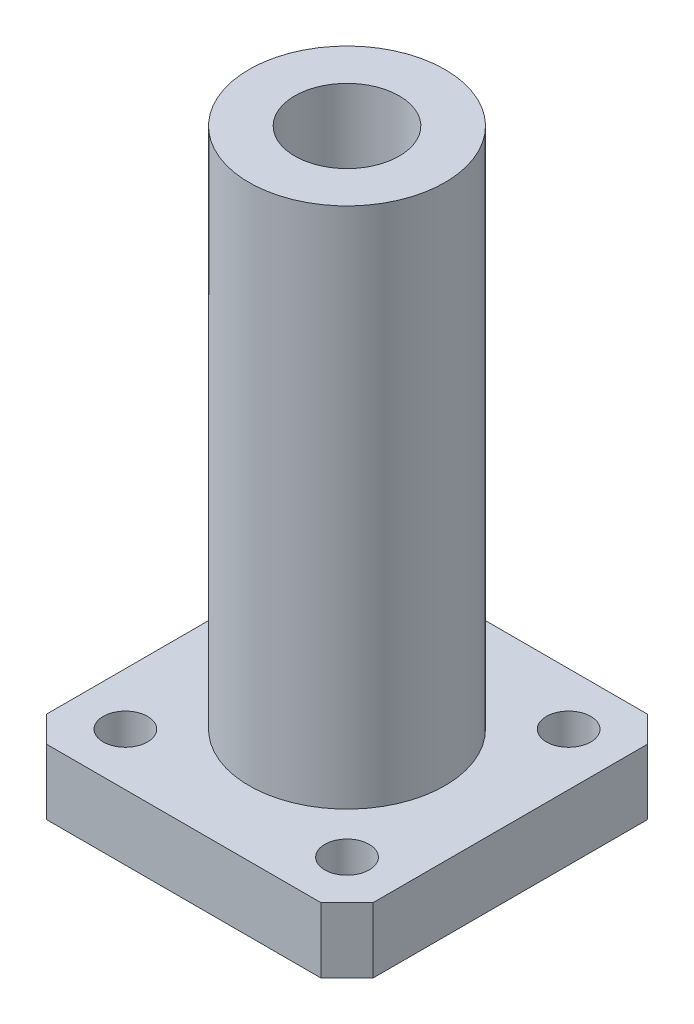
ISO-10303-21;
HEADER;
FILE_DESCRIPTION(('STEP AP214'),'2;1');
FILE_NAME('part.step','',(''),(''),'','','');
FILE_SCHEMA(('AUTOMOTIVE_DESIGN { 1 0 10303 214 1 1 1 1 }'));
ENDSEC;
DATA;
#1=APPLICATION_CONTEXT('core data for automotive mechanical design processes');
#2=APPLICATION_PROTOCOL_DEFINITION('international standard','automotive_design',2000,#1);
#3=PRODUCT_CONTEXT('',#1,'mechanical');
#4=PRODUCT('Part','Part','',(#3));
#5=PRODUCT_RELATED_PRODUCT_CATEGORY('part','',(#4));
#6=PRODUCT_DEFINITION_FORMATION('','',#4);
#7=PRODUCT_DEFINITION_CONTEXT('part definition',#1,'design');
#8=PRODUCT_DEFINITION('design','',#6,#7);
#9=PRODUCT_DEFINITION_SHAPE('','',#8);
#10=(LENGTH_UNIT() NAMED_UNIT(*) SI_UNIT(.MILLI.,.METRE.));
#11=(NAMED_UNIT(*) PLANE_ANGLE_UNIT() SI_UNIT($,.RADIAN.));
#12=(NAMED_UNIT(*) SI_UNIT($,.STERADIAN.) SOLID_ANGLE_UNIT());
#13=UNCERTAINTY_MEASURE_WITH_UNIT(LENGTH_MEASURE(1.E-05),#10,'distance_accuracy_value','');
#14=(GEOMETRIC_REPRESENTATION_CONTEXT(3) GLOBAL_UNCERTAINTY_ASSIGNED_CONTEXT((#13)) GLOBAL_UNIT_ASSIGNED_CONTEXT((#10,
#11,#12)) REPRESENTATION_CONTEXT('',''));
#15=CARTESIAN_POINT('',(0.,0.,0.));
#16=DIRECTION('',(0.,0.,1.));
#17=DIRECTION('',(1.,0.,0.));
#18=AXIS2_PLACEMENT_3D('',#15,#16,#17);
#19=CARTESIAN_POINT('',(8.48528137423857,1.7,-8.48528137423857));
#20=DIRECTION('',(0.,-1.,0.));
#21=DIRECTION('',(0.,0.,-1.));
#22=AXIS2_PLACEMENT_3D('',#19,#20,#21);
#23=CYLINDRICAL_SURFACE('',#22,3.25);
#24=CARTESIAN_POINT('',(8.48528137423857,0.,-8.48528137423857));
#25=DIRECTION('',(0.,-1.,0.));
#26=DIRECTION('',(0.,0.,-1.));
#27=AXIS2_PLACEMENT_3D('',#24,#25,#26);
#28=CIRCLE('',#27,3.25);
#29=CARTESIAN_POINT('',(8.48528137423857,0.,-11.7352813742386));
#30=VERTEX_POINT('',#29);
#31=EDGE_CURVE('E156',#30,#30,#28,.F.);
#32=ORIENTED_EDGE('',*,*,#31,.F.);
#33=EDGE_LOOP('',(#32));
#34=FACE_BOUND('',#33,.T.);
#35=CARTESIAN_POINT('',(8.48528137423857,1.7,-8.48528137423857));
#36=DIRECTION('',(0.,-1.,0.));
#37=DIRECTION('',(0.,0.,-1.));
#38=AXIS2_PLACEMENT_3D('',#35,#36,#37);
#39=CIRCLE('',#38,3.25);
#40=CARTESIAN_POINT('',(8.48528137423857,1.7,-11.7352813742386));
#41=VERTEX_POINT('',#40);
#42=EDGE_CURVE('E158',#41,#41,#39,.T.);
#43=ORIENTED_EDGE('',*,*,#42,.F.);
#44=EDGE_LOOP('',(#43));
#45=FACE_BOUND('',#44,.T.);
#46=ADVANCED_FACE('F16',(#34,#45),#23,.F.);
#47=CARTESIAN_POINT('',(-8.48528137423857,1.7,8.48528137423857));
#48=DIRECTION('',(0.,-1.,0.));
#49=DIRECTION('',(0.,0.,-1.));
#50=AXIS2_PLACEMENT_3D('',#47,#48,#49);
#51=CYLINDRICAL_SURFACE('',#50,3.25);
#52=CARTESIAN_POINT('',(-8.48528137423857,0.,8.48528137423857));
#53=DIRECTION('',(0.,-1.,0.));
#54=DIRECTION('',(0.,0.,-1.));
#55=AXIS2_PLACEMENT_3D('',#52,#53,#54);
#56=CIRCLE('',#55,3.25);
#57=CARTESIAN_POINT('',(-8.48528137423857,0.,5.23528137423857));
#58=VERTEX_POINT('',#57);
#59=EDGE_CURVE('E147',#58,#58,#56,.F.);
#60=ORIENTED_EDGE('',*,*,#59,.F.);
#61=EDGE_LOOP('',(#60));
#62=FACE_BOUND('',#61,.T.);
#63=CARTESIAN_POINT('',(-8.48528137423857,1.7,8.48528137423857));
#64=DIRECTION('',(0.,-1.,0.));
#65=DIRECTION('',(0.,0.,-1.));
#66=AXIS2_PLACEMENT_3D('',#63,#64,#65);
#67=CIRCLE('',#66,3.25);
#68=CARTESIAN_POINT('',(-8.48528137423857,1.7,5.23528137423857));
#69=VERTEX_POINT('',#68);
#70=EDGE_CURVE('E19',#69,#69,#67,.T.);
#71=ORIENTED_EDGE('',*,*,#70,.F.);
#72=EDGE_LOOP('',(#71));
#73=FACE_BOUND('',#72,.T.);
#74=ADVANCED_FACE('F168',(#62,#73),#51,.F.);
#75=CARTESIAN_POINT('',(-8.48528137423857,1.7,-8.48528137423857));
#76=DIRECTION('',(0.,-1.,0.));
#77=DIRECTION('',(0.,0.,-1.));
#78=AXIS2_PLACEMENT_3D('',#75,#76,#77);
#79=CYLINDRICAL_SURFACE('',#78,3.25);
#80=CARTESIAN_POINT('',(-8.48528137423857,0.,-8.48528137423857));
#81=DIRECTION('',(0.,-1.,0.));
#82=DIRECTION('',(0.,0.,-1.));
#83=AXIS2_PLACEMENT_3D('',#80,#81,#82);
#84=CIRCLE('',#83,3.25);
#85=CARTESIAN_POINT('',(-8.48528137423857,0.,-11.7352813742386));
#86=VERTEX_POINT('',#85);
#87=EDGE_CURVE('E153',#86,#86,#84,.F.);
#88=ORIENTED_EDGE('',*,*,#87,.F.);
#89=EDGE_LOOP('',(#88));
#90=FACE_BOUND('',#89,.T.);
#91=CARTESIAN_POINT('',(-8.48528137423857,1.7,-8.48528137423857));
#92=DIRECTION('',(0.,-1.,0.));
#93=DIRECTION('',(0.,0.,-1.));
#94=AXIS2_PLACEMENT_3D('',#91,#92,#93);
#95=CIRCLE('',#94,3.25);
#96=CARTESIAN_POINT('',(-8.48528137423857,1.7,-11.7352813742386));
#97=VERTEX_POINT('',#96);
#98=EDGE_CURVE('E144',#97,#97,#95,.T.);
#99=ORIENTED_EDGE('',*,*,#98,.F.);
#100=EDGE_LOOP('',(#99));
#101=FACE_BOUND('',#100,.T.);
#102=ADVANCED_FACE('F170',(#90,#101),#79,.F.);
#103=CARTESIAN_POINT('',(8.48528137423857,1.7,8.48528137423857));
#104=DIRECTION('',(0.,-1.,0.));
#105=DIRECTION('',(0.,0.,-1.));
#106=AXIS2_PLACEMENT_3D('',#103,#104,#105);
#107=CYLINDRICAL_SURFACE('',#106,3.25);
#108=CARTESIAN_POINT('',(8.48528137423857,0.,8.48528137423857));
#109=DIRECTION('',(0.,-1.,0.));
#110=DIRECTION('',(0.,0.,-1.));
#111=AXIS2_PLACEMENT_3D('',#108,#109,#110);
#112=CIRCLE('',#111,3.25);
#113=CARTESIAN_POINT('',(8.48528137423857,0.,5.23528137423857));
#114=VERTEX_POINT('',#113);
#115=EDGE_CURVE('E150',#114,#114,#112,.F.);
#116=ORIENTED_EDGE('',*,*,#115,.F.);
#117=EDGE_LOOP('',(#116));
#118=FACE_BOUND('',#117,.T.);
#119=CARTESIAN_POINT('',(8.48528137423857,1.7,8.48528137423857));
#120=DIRECTION('',(0.,-1.,0.));
#121=DIRECTION('',(0.,0.,-1.));
#122=AXIS2_PLACEMENT_3D('',#119,#120,#121);
#123=CIRCLE('',#122,3.25);
#124=CARTESIAN_POINT('',(8.48528137423857,1.7,5.23528137423857));
#125=VERTEX_POINT('',#124);
#126=EDGE_CURVE('E141',#125,#125,#123,.T.);
#127=ORIENTED_EDGE('',*,*,#126,.F.);
#128=EDGE_LOOP('',(#127));
#129=FACE_BOUND('',#128,.T.);
#130=ADVANCED_FACE('F177',(#118,#129),#107,.F.);
#131=CARTESIAN_POINT('',(-8.48528137423857,1.7,8.48528137423857));
#132=DIRECTION('',(0.,-1.,0.));
#133=DIRECTION('',(0.,0.,-1.));
#134=AXIS2_PLACEMENT_3D('',#131,#132,#133);
#135=PLANE('',#134);
#136=ORIENTED_EDGE('',*,*,#70,.T.);
#137=EDGE_LOOP('',(#136));
#138=FACE_BOUND('',#137,.T.);
#139=CARTESIAN_POINT('',(-8.48528137423857,1.7,8.48528137423857));
#140=DIRECTION('',(0.,-1.,0.));
#141=DIRECTION('',(0.,0.,-1.));
#142=AXIS2_PLACEMENT_3D('',#139,#140,#141);
#143=CIRCLE('',#142,1.7);
#144=CARTESIAN_POINT('',(-8.48528137423857,1.7,6.78528137423857));
#145=VERTEX_POINT('',#144);
#146=EDGE_CURVE('E135',#145,#145,#143,.F.);
#147=ORIENTED_EDGE('',*,*,#146,.T.);
#148=EDGE_LOOP('',(#147));
#149=FACE_BOUND('',#148,.T.);
#150=ADVANCED_FACE('F165',(#138,#149),#135,.T.);
#151=CARTESIAN_POINT('',(8.48528137423857,1.7,-8.48528137423857));
#152=DIRECTION('',(0.,-1.,0.));
#153=DIRECTION('',(0.,0.,-1.));
#154=AXIS2_PLACEMENT_3D('',#151,#152,#153);
#155=PLANE('',#154);
#156=ORIENTED_EDGE('',*,*,#42,.T.);
#157=EDGE_LOOP('',(#156));
#158=FACE_BOUND('',#157,.T.);
#159=CARTESIAN_POINT('',(8.48528137423857,1.7,-8.48528137423857));
#160=DIRECTION('',(0.,-1.,0.));
#161=DIRECTION('',(0.,0.,-1.));
#162=AXIS2_PLACEMENT_3D('',#159,#160,#161);
#163=CIRCLE('',#162,1.7);
#164=CARTESIAN_POINT('',(8.48528137423857,1.7,-10.1852813742386));
#165=VERTEX_POINT('',#164);
#166=EDGE_CURVE('E91',#165,#165,#163,.F.);
#167=ORIENTED_EDGE('',*,*,#166,.T.);
#168=EDGE_LOOP('',(#167));
#169=FACE_BOUND('',#168,.T.);
#170=ADVANCED_FACE('F256',(#158,#169),#155,.T.);
#171=CARTESIAN_POINT('',(0.,0.,0.));
#172=DIRECTION('',(0.,-1.,0.));
#173=DIRECTION('',(0.,0.,-1.));
#174=AXIS2_PLACEMENT_3D('',#171,#172,#173);
#175=PLANE('',#174);
#176=CARTESIAN_POINT('',(0.,0.,0.));
#177=DIRECTION('',(0.,-1.,0.));
#178=DIRECTION('',(0.,0.,-1.));
#179=AXIS2_PLACEMENT_3D('',#176,#177,#178);
#180=CIRCLE('',#179,4.);
#181=CARTESIAN_POINT('',(0.,0.,-4.));
#182=VERTEX_POINT('',#181);
#183=EDGE_CURVE('E138',#182,#182,#180,.F.);
#184=ORIENTED_EDGE('',*,*,#183,.T.);
#185=EDGE_LOOP('',(#184));
#186=FACE_BOUND('',#185,.T.);
#187=DIRECTION('',(-1.,0.,0.));
#188=VECTOR('',#187,1.);
#189=CARTESIAN_POINT('',(-12.5,0.,12.5));
#190=LINE('',#189,#188);
#191=CARTESIAN_POINT('',(10.5,0.,12.5));
#192=VERTEX_POINT('',#191);
#193=CARTESIAN_POINT('',(-10.5,0.,12.5));
#194=VERTEX_POINT('',#193);
#195=EDGE_CURVE('E322',#192,#194,#190,.T.);
#196=ORIENTED_EDGE('',*,*,#195,.T.);
#197=DIRECTION('',(-0.707106781186548,0.,-0.707106781186548));
#198=VECTOR('',#197,1.);
#199=CARTESIAN_POINT('',(-10.5,0.,12.5));
#200=LINE('',#199,#198);
#201=CARTESIAN_POINT('',(-12.5,0.,10.5));
#202=VERTEX_POINT('',#201);
#203=EDGE_CURVE('E317',#194,#202,#200,.T.);
#204=ORIENTED_EDGE('',*,*,#203,.T.);
#205=DIRECTION('',(0.,0.,-1.));
#206=VECTOR('',#205,1.);
#207=CARTESIAN_POINT('',(-12.5,0.,12.5));
#208=LINE('',#207,#206);
#209=CARTESIAN_POINT('',(-12.5,0.,-10.5));
#210=VERTEX_POINT('',#209);
#211=EDGE_CURVE('E312',#202,#210,#208,.T.);
#212=ORIENTED_EDGE('',*,*,#211,.T.);
#213=DIRECTION('',(0.707106781186548,0.,-0.707106781186548));
#214=VECTOR('',#213,1.);
#215=CARTESIAN_POINT('',(-12.5,0.,-10.5));
#216=LINE('',#215,#214);
#217=CARTESIAN_POINT('',(-10.5,0.,-12.5));
#218=VERTEX_POINT('',#217);
#219=EDGE_CURVE('E307',#210,#218,#216,.T.);
#220=ORIENTED_EDGE('',*,*,#219,.T.);
#221=DIRECTION('',(1.,0.,0.));
#222=VECTOR('',#221,1.);
#223=CARTESIAN_POINT('',(-12.5,0.,-12.5));
#224=LINE('',#223,#222);
#225=CARTESIAN_POINT('',(10.5,0.,-12.5));
#226=VERTEX_POINT('',#225);
#227=EDGE_CURVE('E87',#218,#226,#224,.T.);
#228=ORIENTED_EDGE('',*,*,#227,.T.);
#229=DIRECTION('',(0.707106781186548,0.,0.707106781186548));
#230=VECTOR('',#229,1.);
#231=CARTESIAN_POINT('',(10.5,0.,-12.5));
#232=LINE('',#231,#230);
#233=CARTESIAN_POINT('',(12.5,0.,-10.5));
#234=VERTEX_POINT('',#233);
#235=EDGE_CURVE('E82',#226,#234,#232,.T.);
#236=ORIENTED_EDGE('',*,*,#235,.T.);
#237=DIRECTION('',(0.,0.,1.));
#238=VECTOR('',#237,1.);
#239=CARTESIAN_POINT('',(12.5,0.,12.5));
#240=LINE('',#239,#238);
#241=CARTESIAN_POINT('',(12.5,0.,10.5));
#242=VERTEX_POINT('',#241);
#243=EDGE_CURVE('E79',#234,#242,#240,.T.);
#244=ORIENTED_EDGE('',*,*,#243,.T.);
#245=DIRECTION('',(-0.707106781186548,0.,0.707106781186548));
#246=VECTOR('',#245,1.);
#247=CARTESIAN_POINT('',(12.5,0.,10.5));
#248=LINE('',#247,#246);
#249=EDGE_CURVE('E105',#242,#192,#248,.T.);
#250=ORIENTED_EDGE('',*,*,#249,.T.);
#251=EDGE_LOOP('',(#196,#204,#212,#220,#228,#236,#244,#250));
#252=FACE_BOUND('',#251,.T.);
#253=ORIENTED_EDGE('',*,*,#59,.T.);
#254=EDGE_LOOP('',(#253));
#255=FACE_BOUND('',#254,.T.);
#256=ORIENTED_EDGE('',*,*,#115,.T.);
#257=EDGE_LOOP('',(#256));
#258=FACE_BOUND('',#257,.T.);
#259=ORIENTED_EDGE('',*,*,#87,.T.);
#260=EDGE_LOOP('',(#259));
#261=FACE_BOUND('',#260,.T.);
#262=ORIENTED_EDGE('',*,*,#31,.T.);
#263=EDGE_LOOP('',(#262));
#264=FACE_BOUND('',#263,.T.);
#265=ADVANCED_FACE('F84',(#186,#252,#255,#258,#261,#264),#175,.T.);
#266=CARTESIAN_POINT('',(-8.48528137423857,1.7,-8.48528137423857));
#267=DIRECTION('',(0.,-1.,0.));
#268=DIRECTION('',(0.,0.,-1.));
#269=AXIS2_PLACEMENT_3D('',#266,#267,#268);
#270=PLANE('',#269);
#271=ORIENTED_EDGE('',*,*,#98,.T.);
#272=EDGE_LOOP('',(#271));
#273=FACE_BOUND('',#272,.T.);
#274=CARTESIAN_POINT('',(-8.48528137423857,1.7,-8.48528137423857));
#275=DIRECTION('',(0.,-1.,0.));
#276=DIRECTION('',(0.,0.,-1.));
#277=AXIS2_PLACEMENT_3D('',#274,#275,#276);
#278=CIRCLE('',#277,1.7);
#279=CARTESIAN_POINT('',(-8.48528137423857,1.7,-10.1852813742386));
#280=VERTEX_POINT('',#279);
#281=EDGE_CURVE('E130',#280,#280,#278,.F.);
#282=ORIENTED_EDGE('',*,*,#281,.T.);
#283=EDGE_LOOP('',(#282));
#284=FACE_BOUND('',#283,.T.);
#285=ADVANCED_FACE('F249',(#273,#284),#270,.T.);
#286=CARTESIAN_POINT('',(8.48528137423857,1.7,8.48528137423857));
#287=DIRECTION('',(0.,-1.,0.));
#288=DIRECTION('',(0.,0.,-1.));
#289=AXIS2_PLACEMENT_3D('',#286,#287,#288);
#290=PLANE('',#289);
#291=ORIENTED_EDGE('',*,*,#126,.T.);
#292=EDGE_LOOP('',(#291));
#293=FACE_BOUND('',#292,.T.);
#294=CARTESIAN_POINT('',(8.48528137423857,1.7,8.48528137423857));
#295=DIRECTION('',(0.,-1.,0.));
#296=DIRECTION('',(0.,0.,-1.));
#297=AXIS2_PLACEMENT_3D('',#294,#295,#296);
#298=CIRCLE('',#297,1.7);
#299=CARTESIAN_POINT('',(8.48528137423857,1.7,6.78528137423857));
#300=VERTEX_POINT('',#299);
#301=EDGE_CURVE('E127',#300,#300,#298,.F.);
#302=ORIENTED_EDGE('',*,*,#301,.T.);
#303=EDGE_LOOP('',(#302));
#304=FACE_BOUND('',#303,.T.);
#305=ADVANCED_FACE('F245',(#293,#304),#290,.T.);
#306=CARTESIAN_POINT('',(0.,5.,0.));
#307=DIRECTION('',(0.,-1.,0.));
#308=DIRECTION('',(0.,0.,-1.));
#309=AXIS2_PLACEMENT_3D('',#306,#307,#308);
#310=CYLINDRICAL_SURFACE('',#309,4.);
#311=CARTESIAN_POINT('',(0.,45.,0.));
#312=DIRECTION('',(0.,-1.,0.));
#313=DIRECTION('',(0.,0.,-1.));
#314=AXIS2_PLACEMENT_3D('',#311,#312,#313);
#315=CIRCLE('',#314,4.);
#316=CARTESIAN_POINT('',(0.,45.,-4.));
#317=VERTEX_POINT('',#316);
#318=EDGE_CURVE('E124',#317,#317,#315,.F.);
#319=ORIENTED_EDGE('',*,*,#318,.T.);
#320=EDGE_LOOP('',(#319));
#321=FACE_BOUND('',#320,.T.);
#322=ORIENTED_EDGE('',*,*,#183,.F.);
#323=EDGE_LOOP('',(#322));
#324=FACE_BOUND('',#323,.T.);
#325=ADVANCED_FACE('F241',(#321,#324),#310,.F.);
#326=CARTESIAN_POINT('',(-8.48528137423857,5.,8.48528137423857));
#327=DIRECTION('',(0.,-1.,0.));
#328=DIRECTION('',(0.,0.,-1.));
#329=AXIS2_PLACEMENT_3D('',#326,#327,#328);
#330=CYLINDRICAL_SURFACE('',#329,1.7);
#331=ORIENTED_EDGE('',*,*,#146,.F.);
#332=EDGE_LOOP('',(#331));
#333=FACE_BOUND('',#332,.T.);
#334=CARTESIAN_POINT('',(-8.48528137423857,5.,8.48528137423857));
#335=DIRECTION('',(0.,-1.,0.));
#336=DIRECTION('',(0.,0.,-1.));
#337=AXIS2_PLACEMENT_3D('',#334,#335,#336);
#338=CIRCLE('',#337,1.7);
#339=CARTESIAN_POINT('',(-8.48528137423857,5.,6.78528137423857));
#340=VERTEX_POINT('',#339);
#341=EDGE_CURVE('E121',#340,#340,#338,.F.);
#342=ORIENTED_EDGE('',*,*,#341,.T.);
#343=EDGE_LOOP('',(#342));
#344=FACE_BOUND('',#343,.T.);
#345=ADVANCED_FACE('F237',(#333,#344),#330,.F.);
#346=CARTESIAN_POINT('',(8.48528137423857,5.,-8.48528137423857));
#347=DIRECTION('',(0.,-1.,0.));
#348=DIRECTION('',(0.,0.,-1.));
#349=AXIS2_PLACEMENT_3D('',#346,#347,#348);
#350=CYLINDRICAL_SURFACE('',#349,1.7);
#351=ORIENTED_EDGE('',*,*,#166,.F.);
#352=EDGE_LOOP('',(#351));
#353=FACE_BOUND('',#352,.T.);
#354=CARTESIAN_POINT('',(8.48528137423857,5.,-8.48528137423857));
#355=DIRECTION('',(0.,-1.,0.));
#356=DIRECTION('',(0.,0.,-1.));
#357=AXIS2_PLACEMENT_3D('',#354,#355,#356);
#358=CIRCLE('',#357,1.7);
#359=CARTESIAN_POINT('',(8.48528137423857,5.,-10.1852813742386));
#360=VERTEX_POINT('',#359);
#361=EDGE_CURVE('E118',#360,#360,#358,.F.);
#362=ORIENTED_EDGE('',*,*,#361,.T.);
#363=EDGE_LOOP('',(#362));
#364=FACE_BOUND('',#363,.T.);
#365=ADVANCED_FACE('F234',(#353,#364),#350,.F.);
#366=CARTESIAN_POINT('',(10.5,5.,-12.5));
#367=DIRECTION('',(-0.707106781186548,0.,0.707106781186548));
#368=DIRECTION('',(0.707106781186548,0.,0.707106781186548));
#369=AXIS2_PLACEMENT_3D('',#366,#367,#368);
#370=PLANE('',#369);
#371=DIRECTION('',(0.,1.,0.));
#372=VECTOR('',#371,1.);
#373=CARTESIAN_POINT('',(12.5,5.,-10.5));
#374=LINE('',#373,#372);
#375=CARTESIAN_POINT('',(12.5,5.,-10.5));
#376=VERTEX_POINT('',#375);
#377=EDGE_CURVE('E90',#376,#234,#374,.F.);
#378=ORIENTED_EDGE('',*,*,#377,.T.);
#379=ORIENTED_EDGE('',*,*,#235,.F.);
#380=DIRECTION('',(0.,1.,0.));
#381=VECTOR('',#380,1.);
#382=CARTESIAN_POINT('',(10.5,5.,-12.5));
#383=LINE('',#382,#381);
#384=CARTESIAN_POINT('',(10.5,5.,-12.5));
#385=VERTEX_POINT('',#384);
#386=EDGE_CURVE('E305',#226,#385,#383,.T.);
#387=ORIENTED_EDGE('',*,*,#386,.T.);
#388=DIRECTION('',(0.707106781186547,0.,0.707106781186548));
#389=VECTOR('',#388,1.);
#390=CARTESIAN_POINT('',(10.5,5.,-12.5));
#391=LINE('',#390,#389);
#392=EDGE_CURVE('E96',#385,#376,#391,.T.);
#393=ORIENTED_EDGE('',*,*,#392,.T.);
#394=EDGE_LOOP('',(#378,#379,#387,#393));
#395=FACE_BOUND('',#394,.T.);
#396=ADVANCED_FACE('F94',(#395),#370,.F.);
#397=CARTESIAN_POINT('',(12.5,5.,12.5));
#398=DIRECTION('',(-1.,0.,0.));
#399=DIRECTION('',(0.,0.,1.));
#400=AXIS2_PLACEMENT_3D('',#397,#398,#399);
#401=PLANE('',#400);
#402=ORIENTED_EDGE('',*,*,#377,.F.);
#403=DIRECTION('',(0.,0.,-1.));
#404=VECTOR('',#403,1.);
#405=CARTESIAN_POINT('',(12.5,5.,0.));
#406=LINE('',#405,#404);
#407=CARTESIAN_POINT('',(12.5,5.,10.5));
#408=VERTEX_POINT('',#407);
#409=EDGE_CURVE('E299',#376,#408,#406,.F.);
#410=ORIENTED_EDGE('',*,*,#409,.T.);
#411=DIRECTION('',(0.,1.,0.));
#412=VECTOR('',#411,1.);
#413=CARTESIAN_POINT('',(12.5,5.,10.5));
#414=LINE('',#413,#412);
#415=EDGE_CURVE('E102',#408,#242,#414,.F.);
#416=ORIENTED_EDGE('',*,*,#415,.T.);
#417=ORIENTED_EDGE('',*,*,#243,.F.);
#418=EDGE_LOOP('',(#402,#410,#416,#417));
#419=FACE_BOUND('',#418,.T.);
#420=ADVANCED_FACE('F100',(#419),#401,.F.);
#421=CARTESIAN_POINT('',(12.5,5.,10.5));
#422=DIRECTION('',(-0.707106781186548,0.,-0.707106781186548));
#423=DIRECTION('',(-0.707106781186548,0.,0.707106781186548));
#424=AXIS2_PLACEMENT_3D('',#421,#422,#423);
#425=PLANE('',#424);
#426=DIRECTION('',(0.,1.,0.));
#427=VECTOR('',#426,1.);
#428=CARTESIAN_POINT('',(10.5,5.,12.5));
#429=LINE('',#428,#427);
#430=CARTESIAN_POINT('',(10.5,5.,12.5));
#431=VERTEX_POINT('',#430);
#432=EDGE_CURVE('E324',#431,#192,#429,.F.);
#433=ORIENTED_EDGE('',*,*,#432,.T.);
#434=ORIENTED_EDGE('',*,*,#249,.F.);
#435=ORIENTED_EDGE('',*,*,#415,.F.);
#436=DIRECTION('',(-0.707106781186548,0.,0.707106781186547));
#437=VECTOR('',#436,1.);
#438=CARTESIAN_POINT('',(12.5,5.,10.5));
#439=LINE('',#438,#437);
#440=EDGE_CURVE('E297',#408,#431,#439,.T.);
#441=ORIENTED_EDGE('',*,*,#440,.T.);
#442=EDGE_LOOP('',(#433,#434,#435,#441));
#443=FACE_BOUND('',#442,.T.);
#444=ADVANCED_FACE('F225',(#443),#425,.F.);
#445=CARTESIAN_POINT('',(-12.5,5.,12.5));
#446=DIRECTION('',(0.,0.,-1.));
#447=DIRECTION('',(-1.,0.,0.));
#448=AXIS2_PLACEMENT_3D('',#445,#446,#447);
#449=PLANE('',#448);
#450=ORIENTED_EDGE('',*,*,#432,.F.);
#451=DIRECTION('',(1.,0.,0.));
#452=VECTOR('',#451,1.);
#453=CARTESIAN_POINT('',(0.,5.,12.5));
#454=LINE('',#453,#452);
#455=CARTESIAN_POINT('',(-10.5,5.,12.5));
#456=VERTEX_POINT('',#455);
#457=EDGE_CURVE('E295',#431,#456,#454,.F.);
#458=ORIENTED_EDGE('',*,*,#457,.T.);
#459=DIRECTION('',(0.,1.,0.));
#460=VECTOR('',#459,1.);
#461=CARTESIAN_POINT('',(-10.5,5.,12.5));
#462=LINE('',#461,#460);
#463=EDGE_CURVE('E319',#456,#194,#462,.F.);
#464=ORIENTED_EDGE('',*,*,#463,.T.);
#465=ORIENTED_EDGE('',*,*,#195,.F.);
#466=EDGE_LOOP('',(#450,#458,#464,#465));
#467=FACE_BOUND('',#466,.T.);
#468=ADVANCED_FACE('F221',(#467),#449,.F.);
#469=CARTESIAN_POINT('',(-10.5,5.,12.5));
#470=DIRECTION('',(0.707106781186548,0.,-0.707106781186548));
#471=DIRECTION('',(-0.707106781186548,0.,-0.707106781186548));
#472=AXIS2_PLACEMENT_3D('',#469,#470,#471);
#473=PLANE('',#472);
#474=DIRECTION('',(0.,1.,0.));
#475=VECTOR('',#474,1.);
#476=CARTESIAN_POINT('',(-12.5,5.,10.5));
#477=LINE('',#476,#475);
#478=CARTESIAN_POINT('',(-12.5,5.,10.5));
#479=VERTEX_POINT('',#478);
#480=EDGE_CURVE('E314',#479,#202,#477,.F.);
#481=ORIENTED_EDGE('',*,*,#480,.T.);
#482=ORIENTED_EDGE('',*,*,#203,.F.);
#483=ORIENTED_EDGE('',*,*,#463,.F.);
#484=DIRECTION('',(-0.707106781186547,0.,-0.707106781186548));
#485=VECTOR('',#484,1.);
#486=CARTESIAN_POINT('',(-10.5,5.,12.5));
#487=LINE('',#486,#485);
#488=EDGE_CURVE('E291',#456,#479,#487,.T.);
#489=ORIENTED_EDGE('',*,*,#488,.T.);
#490=EDGE_LOOP('',(#481,#482,#483,#489));
#491=FACE_BOUND('',#490,.T.);
#492=ADVANCED_FACE('F217',(#491),#473,.F.);
#493=CARTESIAN_POINT('',(-12.5,5.,12.5));
#494=DIRECTION('',(1.,0.,0.));
#495=DIRECTION('',(0.,0.,-1.));
#496=AXIS2_PLACEMENT_3D('',#493,#494,#495);
#497=PLANE('',#496);
#498=DIRECTION('',(0.,1.,0.));
#499=VECTOR('',#498,1.);
#500=CARTESIAN_POINT('',(-12.5,5.,-10.5));
#501=LINE('',#500,#499);
#502=CARTESIAN_POINT('',(-12.5,5.,-10.5));
#503=VERTEX_POINT('',#502);
#504=EDGE_CURVE('E309',#503,#210,#501,.F.);
#505=ORIENTED_EDGE('',*,*,#504,.T.);
#506=ORIENTED_EDGE('',*,*,#211,.F.);
#507=ORIENTED_EDGE('',*,*,#480,.F.);
#508=DIRECTION('',(0.,0.,-1.));
#509=VECTOR('',#508,1.);
#510=CARTESIAN_POINT('',(-12.5,5.,0.));
#511=LINE('',#510,#509);
#512=EDGE_CURVE('E287',#479,#503,#511,.T.);
#513=ORIENTED_EDGE('',*,*,#512,.T.);
#514=EDGE_LOOP('',(#505,#506,#507,#513));
#515=FACE_BOUND('',#514,.T.);
#516=ADVANCED_FACE('F214',(#515),#497,.F.);
#517=CARTESIAN_POINT('',(-12.5,5.,-10.5));
#518=DIRECTION('',(0.707106781186548,0.,0.707106781186548));
#519=DIRECTION('',(0.707106781186548,0.,-0.707106781186548));
#520=AXIS2_PLACEMENT_3D('',#517,#518,#519);
#521=PLANE('',#520);
#522=DIRECTION('',(0.,1.,0.));
#523=VECTOR('',#522,1.);
#524=CARTESIAN_POINT('',(-10.5,5.,-12.5));
#525=LINE('',#524,#523);
#526=CARTESIAN_POINT('',(-10.5,5.,-12.5));
#527=VERTEX_POINT('',#526);
#528=EDGE_CURVE('E303',#527,#218,#525,.F.);
#529=ORIENTED_EDGE('',*,*,#528,.T.);
#530=ORIENTED_EDGE('',*,*,#219,.F.);
#531=ORIENTED_EDGE('',*,*,#504,.F.);
#532=DIRECTION('',(0.707106781186547,0.,-0.707106781186548));
#533=VECTOR('',#532,1.);
#534=CARTESIAN_POINT('',(-12.5,5.,-10.5));
#535=LINE('',#534,#533);
#536=EDGE_CURVE('E34',#503,#527,#535,.T.);
#537=ORIENTED_EDGE('',*,*,#536,.T.);
#538=EDGE_LOOP('',(#529,#530,#531,#537));
#539=FACE_BOUND('',#538,.T.);
#540=ADVANCED_FACE('F210',(#539),#521,.F.);
#541=CARTESIAN_POINT('',(-12.5,5.,-12.5));
#542=DIRECTION('',(0.,0.,1.));
#543=DIRECTION('',(1.,0.,0.));
#544=AXIS2_PLACEMENT_3D('',#541,#542,#543);
#545=PLANE('',#544);
#546=ORIENTED_EDGE('',*,*,#528,.F.);
#547=DIRECTION('',(1.,0.,0.));
#548=VECTOR('',#547,1.);
#549=CARTESIAN_POINT('',(0.,5.,-12.5));
#550=LINE('',#549,#548);
#551=EDGE_CURVE('E117',#527,#385,#550,.T.);
#552=ORIENTED_EDGE('',*,*,#551,.T.);
#553=ORIENTED_EDGE('',*,*,#386,.F.);
#554=ORIENTED_EDGE('',*,*,#227,.F.);
#555=EDGE_LOOP('',(#546,#552,#553,#554));
#556=FACE_BOUND('',#555,.T.);
#557=ADVANCED_FACE('F206',(#556),#545,.F.);
#558=CARTESIAN_POINT('',(-8.48528137423857,5.,-8.48528137423857));
#559=DIRECTION('',(0.,-1.,0.));
#560=DIRECTION('',(0.,0.,-1.));
#561=AXIS2_PLACEMENT_3D('',#558,#559,#560);
#562=CYLINDRICAL_SURFACE('',#561,1.7);
#563=ORIENTED_EDGE('',*,*,#281,.F.);
#564=EDGE_LOOP('',(#563));
#565=FACE_BOUND('',#564,.T.);
#566=CARTESIAN_POINT('',(-8.48528137423857,5.,-8.48528137423857));
#567=DIRECTION('',(0.,-1.,0.));
#568=DIRECTION('',(0.,0.,-1.));
#569=AXIS2_PLACEMENT_3D('',#566,#567,#568);
#570=CIRCLE('',#569,1.7);
#571=CARTESIAN_POINT('',(-8.48528137423857,5.,-10.1852813742386));
#572=VERTEX_POINT('',#571);
#573=EDGE_CURVE('E114',#572,#572,#570,.F.);
#574=ORIENTED_EDGE('',*,*,#573,.T.);
#575=EDGE_LOOP('',(#574));
#576=FACE_BOUND('',#575,.T.);
#577=ADVANCED_FACE('F202',(#565,#576),#562,.F.);
#578=CARTESIAN_POINT('',(8.48528137423857,5.,8.48528137423857));
#579=DIRECTION('',(0.,-1.,0.));
#580=DIRECTION('',(0.,0.,-1.));
#581=AXIS2_PLACEMENT_3D('',#578,#579,#580);
#582=CYLINDRICAL_SURFACE('',#581,1.7);
#583=ORIENTED_EDGE('',*,*,#301,.F.);
#584=EDGE_LOOP('',(#583));
#585=FACE_BOUND('',#584,.T.);
#586=CARTESIAN_POINT('',(8.48528137423857,5.,8.48528137423857));
#587=DIRECTION('',(0.,-1.,0.));
#588=DIRECTION('',(0.,0.,-1.));
#589=AXIS2_PLACEMENT_3D('',#586,#587,#588);
#590=CIRCLE('',#589,1.7);
#591=CARTESIAN_POINT('',(8.48528137423857,5.,6.78528137423857));
#592=VERTEX_POINT('',#591);
#593=EDGE_CURVE('E111',#592,#592,#590,.F.);
#594=ORIENTED_EDGE('',*,*,#593,.T.);
#595=EDGE_LOOP('',(#594));
#596=FACE_BOUND('',#595,.T.);
#597=ADVANCED_FACE('F198',(#585,#596),#582,.F.);
#598=CARTESIAN_POINT('',(0.,45.,0.));
#599=DIRECTION('',(0.,-1.,0.));
#600=DIRECTION('',(0.,0.,-1.));
#601=AXIS2_PLACEMENT_3D('',#598,#599,#600);
#602=PLANE('',#601);
#603=CARTESIAN_POINT('',(0.,45.,0.));
#604=DIRECTION('',(0.,-1.,0.));
#605=DIRECTION('',(0.,0.,-1.));
#606=AXIS2_PLACEMENT_3D('',#603,#604,#605);
#607=CIRCLE('',#606,7.5);
#608=CARTESIAN_POINT('',(0.,45.,-7.5));
#609=VERTEX_POINT('',#608);
#610=EDGE_CURVE('E25',#609,#609,#607,.T.);
#611=ORIENTED_EDGE('',*,*,#610,.F.);
#612=EDGE_LOOP('',(#611));
#613=FACE_BOUND('',#612,.T.);
#614=ORIENTED_EDGE('',*,*,#318,.F.);
#615=EDGE_LOOP('',(#614));
#616=FACE_BOUND('',#615,.T.);
#617=ADVANCED_FACE('F191',(#613,#616),#602,.F.);
#618=CARTESIAN_POINT('',(0.,5.,0.));
#619=DIRECTION('',(0.,-1.,0.));
#620=DIRECTION('',(0.,0.,-1.));
#621=AXIS2_PLACEMENT_3D('',#618,#619,#620);
#622=PLANE('',#621);
#623=ORIENTED_EDGE('',*,*,#593,.F.);
#624=EDGE_LOOP('',(#623));
#625=FACE_BOUND('',#624,.T.);
#626=ORIENTED_EDGE('',*,*,#573,.F.);
#627=EDGE_LOOP('',(#626));
#628=FACE_BOUND('',#627,.T.);
#629=ORIENTED_EDGE('',*,*,#536,.F.);
#630=ORIENTED_EDGE('',*,*,#512,.F.);
#631=ORIENTED_EDGE('',*,*,#488,.F.);
#632=ORIENTED_EDGE('',*,*,#457,.F.);
#633=ORIENTED_EDGE('',*,*,#440,.F.);
#634=ORIENTED_EDGE('',*,*,#409,.F.);
#635=ORIENTED_EDGE('',*,*,#392,.F.);
#636=ORIENTED_EDGE('',*,*,#551,.F.);
#637=EDGE_LOOP('',(#629,#630,#631,#632,#633,#634,#635,#636));
#638=FACE_BOUND('',#637,.T.);
#639=ORIENTED_EDGE('',*,*,#361,.F.);
#640=EDGE_LOOP('',(#639));
#641=FACE_BOUND('',#640,.T.);
#642=ORIENTED_EDGE('',*,*,#341,.F.);
#643=EDGE_LOOP('',(#642));
#644=FACE_BOUND('',#643,.T.);
#645=CARTESIAN_POINT('',(0.,5.,0.));
#646=DIRECTION('',(0.,-1.,0.));
#647=DIRECTION('',(0.,0.,-1.));
#648=AXIS2_PLACEMENT_3D('',#645,#646,#647);
#649=CIRCLE('',#648,7.5);
#650=CARTESIAN_POINT('',(0.,5.,-7.5));
#651=VERTEX_POINT('',#650);
#652=EDGE_CURVE('E11',#651,#651,#649,.F.);
#653=ORIENTED_EDGE('',*,*,#652,.F.);
#654=EDGE_LOOP('',(#653));
#655=FACE_BOUND('',#654,.T.);
#656=ADVANCED_FACE('F185',(#625,#628,#638,#641,#644,#655),#622,.F.);
#657=CARTESIAN_POINT('',(0.,45.,0.));
#658=DIRECTION('',(0.,-1.,0.));
#659=DIRECTION('',(0.,0.,-1.));
#660=AXIS2_PLACEMENT_3D('',#657,#658,#659);
#661=CYLINDRICAL_SURFACE('',#660,7.5);
#662=ORIENTED_EDGE('',*,*,#652,.T.);
#663=EDGE_LOOP('',(#662));
#664=FACE_BOUND('',#663,.T.);
#665=ORIENTED_EDGE('',*,*,#610,.T.);
#666=EDGE_LOOP('',(#665));
#667=FACE_BOUND('',#666,.T.);
#668=ADVANCED_FACE('F183',(#664,#667),#661,.T.);
#669=CLOSED_SHELL('',(#46,#74,#102,#130,#150,#170,#265,#285,#305,#325,#345,#365,#396,#420,#444,
#468,#492,#516,#540,#557,#577,#597,#617,#656,#668));
#670=MANIFOLD_SOLID_BREP('B1',#669);
#671=ADVANCED_BREP_SHAPE_REPRESENTATION('',(#18,#670),#14);
#672=SHAPE_DEFINITION_REPRESENTATION(#9,#671);
ENDSEC;
END-ISO-10303-21;
